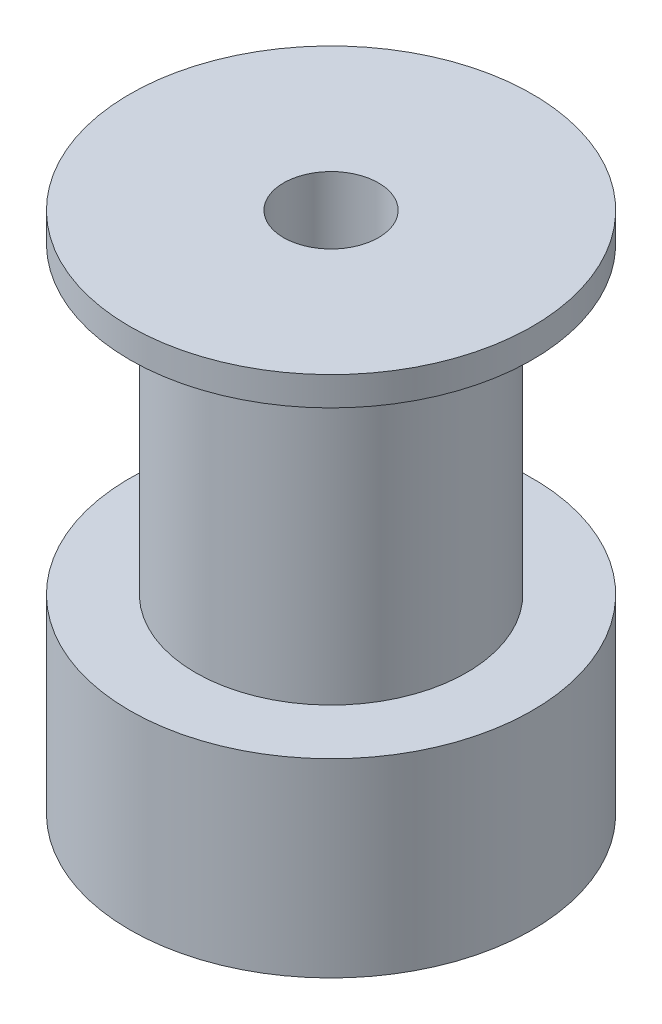
ISO-10303-21;
HEADER;
FILE_DESCRIPTION(('STEP AP214'),'2;1');
FILE_NAME('part.step','',(''),(''),'','','');
FILE_SCHEMA(('AUTOMOTIVE_DESIGN { 1 0 10303 214 1 1 1 1 }'));
ENDSEC;
DATA;
#1=APPLICATION_CONTEXT('core data for automotive mechanical design processes');
#2=APPLICATION_PROTOCOL_DEFINITION('international standard','automotive_design',2000,#1);
#3=PRODUCT_CONTEXT('',#1,'mechanical');
#4=PRODUCT('Part','Part','',(#3));
#5=PRODUCT_RELATED_PRODUCT_CATEGORY('part','',(#4));
#6=PRODUCT_DEFINITION_FORMATION('','',#4);
#7=PRODUCT_DEFINITION_CONTEXT('part definition',#1,'design');
#8=PRODUCT_DEFINITION('design','',#6,#7);
#9=PRODUCT_DEFINITION_SHAPE('','',#8);
#10=(LENGTH_UNIT() NAMED_UNIT(*) SI_UNIT(.MILLI.,.METRE.));
#11=(NAMED_UNIT(*) PLANE_ANGLE_UNIT() SI_UNIT($,.RADIAN.));
#12=(NAMED_UNIT(*) SI_UNIT($,.STERADIAN.) SOLID_ANGLE_UNIT());
#13=UNCERTAINTY_MEASURE_WITH_UNIT(LENGTH_MEASURE(1.E-05),#10,'distance_accuracy_value','');
#14=(GEOMETRIC_REPRESENTATION_CONTEXT(3) GLOBAL_UNCERTAINTY_ASSIGNED_CONTEXT((#13)) GLOBAL_UNIT_ASSIGNED_CONTEXT((#10,
#11,#12)) REPRESENTATION_CONTEXT('',''));
#15=CARTESIAN_POINT('',(0.,0.,0.));
#16=DIRECTION('',(0.,0.,1.));
#17=DIRECTION('',(1.,0.,0.));
#18=AXIS2_PLACEMENT_3D('',#15,#16,#17);
#19=CARTESIAN_POINT('',(0.,17.4752,0.));
#20=DIRECTION('',(0.,-1.,0.));
#21=DIRECTION('',(0.,0.,-1.));
#22=AXIS2_PLACEMENT_3D('',#19,#20,#21);
#23=CYLINDRICAL_SURFACE('',#22,6.731);
#24=CARTESIAN_POINT('',(0.,0.,0.));
#25=DIRECTION('',(0.,1.,0.));
#26=DIRECTION('',(0.,0.,1.));
#27=AXIS2_PLACEMENT_3D('',#24,#25,#26);
#28=CIRCLE('',#27,6.731);
#29=CARTESIAN_POINT('',(0.,0.,6.731));
#30=VERTEX_POINT('',#29);
#31=EDGE_CURVE('E34',#30,#30,#28,.T.);
#32=ORIENTED_EDGE('',*,*,#31,.T.);
#33=EDGE_LOOP('',(#32));
#34=FACE_BOUND('',#33,.T.);
#35=CARTESIAN_POINT('',(0.,6.35,0.));
#36=DIRECTION('',(0.,1.,0.));
#37=DIRECTION('',(0.,0.,1.));
#38=AXIS2_PLACEMENT_3D('',#35,#36,#37);
#39=CIRCLE('',#38,6.73100000000001);
#40=CARTESIAN_POINT('',(0.,6.35,6.73100000000001));
#41=VERTEX_POINT('',#40);
#42=EDGE_CURVE('E41',#41,#41,#39,.T.);
#43=ORIENTED_EDGE('',*,*,#42,.F.);
#44=EDGE_LOOP('',(#43));
#45=FACE_BOUND('',#44,.T.);
#46=ADVANCED_FACE('F31',(#34,#45),#23,.T.);
#47=CARTESIAN_POINT('',(0.,0.,0.));
#48=DIRECTION('',(0.,1.,0.));
#49=DIRECTION('',(0.,0.,1.));
#50=AXIS2_PLACEMENT_3D('',#47,#48,#49);
#51=PLANE('',#50);
#52=CARTESIAN_POINT('',(0.,0.,0.));
#53=DIRECTION('',(0.,1.,0.));
#54=DIRECTION('',(0.,0.,1.));
#55=AXIS2_PLACEMENT_3D('',#52,#53,#54);
#56=CIRCLE('',#55,1.5875);
#57=CARTESIAN_POINT('',(0.,0.,1.5875));
#58=VERTEX_POINT('',#57);
#59=EDGE_CURVE('E54',#58,#58,#56,.T.);
#60=ORIENTED_EDGE('',*,*,#59,.T.);
#61=EDGE_LOOP('',(#60));
#62=FACE_BOUND('',#61,.T.);
#63=ORIENTED_EDGE('',*,*,#31,.F.);
#64=EDGE_LOOP('',(#63));
#65=FACE_BOUND('',#64,.T.);
#66=ADVANCED_FACE('F61',(#62,#65),#51,.F.);
#67=CARTESIAN_POINT('',(0.,6.35,-6.73100000000001));
#68=DIRECTION('',(0.,1.,0.));
#69=DIRECTION('',(0.,0.,1.));
#70=AXIS2_PLACEMENT_3D('',#67,#68,#69);
#71=PLANE('',#70);
#72=ORIENTED_EDGE('',*,*,#42,.T.);
#73=EDGE_LOOP('',(#72));
#74=FACE_BOUND('',#73,.T.);
#75=CARTESIAN_POINT('',(0.,6.35,0.));
#76=DIRECTION('',(0.,1.,0.));
#77=DIRECTION('',(0.,0.,1.));
#78=AXIS2_PLACEMENT_3D('',#75,#76,#77);
#79=CIRCLE('',#78,4.5339);
#80=CARTESIAN_POINT('',(0.,6.35,4.5339));
#81=VERTEX_POINT('',#80);
#82=EDGE_CURVE('E45',#81,#81,#79,.T.);
#83=ORIENTED_EDGE('',*,*,#82,.F.);
#84=EDGE_LOOP('',(#83));
#85=FACE_BOUND('',#84,.T.);
#86=ADVANCED_FACE('F89',(#74,#85),#71,.T.);
#87=CARTESIAN_POINT('',(0.,18.3093316774291,0.));
#88=DIRECTION('',(0.,1.,0.));
#89=DIRECTION('',(0.,0.,1.));
#90=AXIS2_PLACEMENT_3D('',#87,#88,#89);
#91=CYLINDRICAL_SURFACE('',#90,4.5339);
#92=ORIENTED_EDGE('',*,*,#82,.T.);
#93=EDGE_LOOP('',(#92));
#94=FACE_BOUND('',#93,.T.);
#95=CARTESIAN_POINT('',(0.,16.51,0.));
#96=DIRECTION('',(0.,1.,0.));
#97=DIRECTION('',(0.,0.,1.));
#98=AXIS2_PLACEMENT_3D('',#95,#96,#97);
#99=CIRCLE('',#98,4.5339);
#100=CARTESIAN_POINT('',(0.,16.51,4.5339));
#101=VERTEX_POINT('',#100);
#102=EDGE_CURVE('E48',#101,#101,#99,.T.);
#103=ORIENTED_EDGE('',*,*,#102,.F.);
#104=EDGE_LOOP('',(#103));
#105=FACE_BOUND('',#104,.T.);
#106=ADVANCED_FACE('F80',(#94,#105),#91,.T.);
#107=CARTESIAN_POINT('',(0.,16.51,-6.731));
#108=DIRECTION('',(0.,-1.,0.));
#109=DIRECTION('',(0.,0.,-1.));
#110=AXIS2_PLACEMENT_3D('',#107,#108,#109);
#111=PLANE('',#110);
#112=ORIENTED_EDGE('',*,*,#102,.T.);
#113=EDGE_LOOP('',(#112));
#114=FACE_BOUND('',#113,.T.);
#115=CARTESIAN_POINT('',(0.,16.51,0.));
#116=DIRECTION('',(0.,1.,0.));
#117=DIRECTION('',(0.,0.,1.));
#118=AXIS2_PLACEMENT_3D('',#115,#116,#117);
#119=CIRCLE('',#118,6.731);
#120=CARTESIAN_POINT('',(0.,16.51,6.731));
#121=VERTEX_POINT('',#120);
#122=EDGE_CURVE('E51',#121,#121,#119,.T.);
#123=ORIENTED_EDGE('',*,*,#122,.F.);
#124=EDGE_LOOP('',(#123));
#125=FACE_BOUND('',#124,.T.);
#126=ADVANCED_FACE('F73',(#114,#125),#111,.T.);
#127=CARTESIAN_POINT('',(0.,17.4752,0.));
#128=DIRECTION('',(0.,1.,0.));
#129=DIRECTION('',(0.,0.,1.));
#130=AXIS2_PLACEMENT_3D('',#127,#128,#129);
#131=PLANE('',#130);
#132=CARTESIAN_POINT('',(0.,17.4752,0.));
#133=DIRECTION('',(0.,1.,0.));
#134=DIRECTION('',(0.,0.,1.));
#135=AXIS2_PLACEMENT_3D('',#132,#133,#134);
#136=CIRCLE('',#135,1.5875);
#137=CARTESIAN_POINT('',(0.,17.4752,1.5875));
#138=VERTEX_POINT('',#137);
#139=EDGE_CURVE('E55',#138,#138,#136,.T.);
#140=ORIENTED_EDGE('',*,*,#139,.F.);
#141=EDGE_LOOP('',(#140));
#142=FACE_BOUND('',#141,.T.);
#143=CARTESIAN_POINT('',(0.,17.4752,0.));
#144=DIRECTION('',(0.,1.,0.));
#145=DIRECTION('',(0.,0.,1.));
#146=AXIS2_PLACEMENT_3D('',#143,#144,#145);
#147=CIRCLE('',#146,6.731);
#148=CARTESIAN_POINT('',(0.,17.4752,6.731));
#149=VERTEX_POINT('',#148);
#150=EDGE_CURVE('E10',#149,#149,#147,.T.);
#151=ORIENTED_EDGE('',*,*,#150,.T.);
#152=EDGE_LOOP('',(#151));
#153=FACE_BOUND('',#152,.T.);
#154=ADVANCED_FACE('F71',(#142,#153),#131,.T.);
#155=ORIENTED_EDGE('',*,*,#150,.F.);
#156=EDGE_LOOP('',(#155));
#157=FACE_BOUND('',#156,.T.);
#158=ORIENTED_EDGE('',*,*,#122,.T.);
#159=EDGE_LOOP('',(#158));
#160=FACE_BOUND('',#159,.T.);
#161=ADVANCED_FACE('F67',(#157,#160),#23,.T.);
#162=CARTESIAN_POINT('',(0.,0.,0.));
#163=DIRECTION('',(0.,1.,0.));
#164=DIRECTION('',(0.,0.,1.));
#165=AXIS2_PLACEMENT_3D('',#162,#163,#164);
#166=CYLINDRICAL_SURFACE('',#165,1.5875);
#167=ORIENTED_EDGE('',*,*,#59,.F.);
#168=EDGE_LOOP('',(#167));
#169=FACE_BOUND('',#168,.T.);
#170=ORIENTED_EDGE('',*,*,#139,.T.);
#171=EDGE_LOOP('',(#170));
#172=FACE_BOUND('',#171,.T.);
#173=ADVANCED_FACE('F64',(#169,#172),#166,.F.);
#174=CLOSED_SHELL('',(#46,#66,#86,#106,#126,#154,#161,#173));
#175=MANIFOLD_SOLID_BREP('B2',#174);
#176=ADVANCED_BREP_SHAPE_REPRESENTATION('',(#18,#175),#14);
#177=SHAPE_DEFINITION_REPRESENTATION(#9,#176);
ENDSEC;
END-ISO-10303-21;
